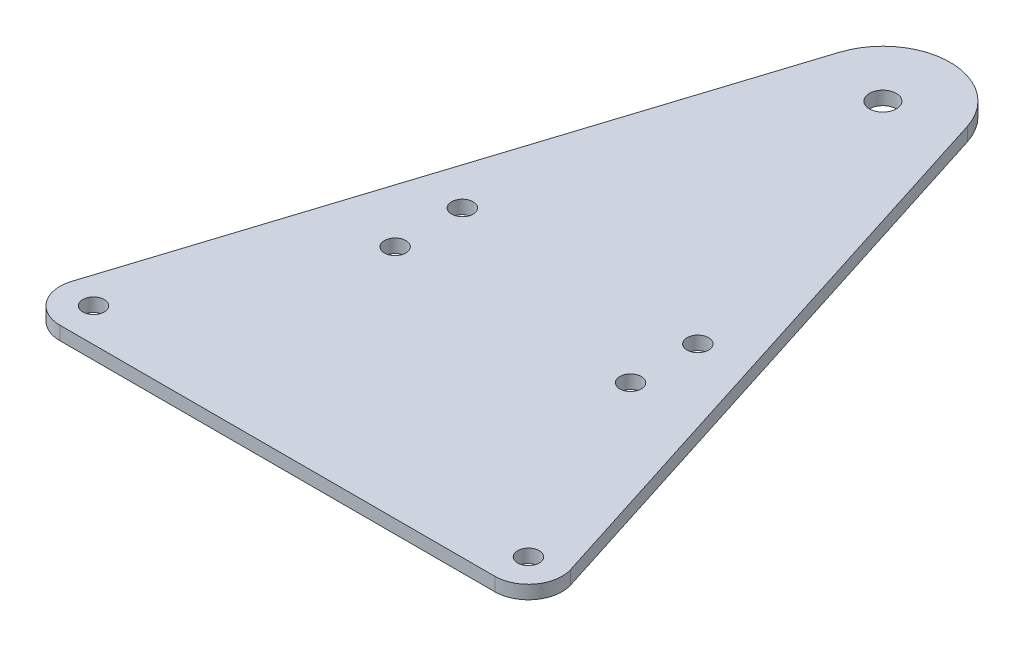
ISO-10303-21;
HEADER;
FILE_DESCRIPTION(('STEP AP214'),'2;1');
FILE_NAME('part.step','',(''),(''),'','','');
FILE_SCHEMA(('AUTOMOTIVE_DESIGN { 1 0 10303 214 1 1 1 1 }'));
ENDSEC;
DATA;
#1=APPLICATION_CONTEXT('core data for automotive mechanical design processes');
#2=APPLICATION_PROTOCOL_DEFINITION('international standard','automotive_design',2000,#1);
#3=PRODUCT_CONTEXT('',#1,'mechanical');
#4=PRODUCT('Part','Part','',(#3));
#5=PRODUCT_RELATED_PRODUCT_CATEGORY('part','',(#4));
#6=PRODUCT_DEFINITION_FORMATION('','',#4);
#7=PRODUCT_DEFINITION_CONTEXT('part definition',#1,'design');
#8=PRODUCT_DEFINITION('design','',#6,#7);
#9=PRODUCT_DEFINITION_SHAPE('','',#8);
#10=(LENGTH_UNIT() NAMED_UNIT(*) SI_UNIT(.MILLI.,.METRE.));
#11=(NAMED_UNIT(*) PLANE_ANGLE_UNIT() SI_UNIT($,.RADIAN.));
#12=(NAMED_UNIT(*) SI_UNIT($,.STERADIAN.) SOLID_ANGLE_UNIT());
#13=UNCERTAINTY_MEASURE_WITH_UNIT(LENGTH_MEASURE(1.E-05),#10,'distance_accuracy_value','');
#14=(GEOMETRIC_REPRESENTATION_CONTEXT(3) GLOBAL_UNCERTAINTY_ASSIGNED_CONTEXT((#13)) GLOBAL_UNIT_ASSIGNED_CONTEXT((#10,
#11,#12)) REPRESENTATION_CONTEXT('',''));
#15=CARTESIAN_POINT('',(0.,0.,0.));
#16=DIRECTION('',(0.,0.,1.));
#17=DIRECTION('',(1.,0.,0.));
#18=AXIS2_PLACEMENT_3D('',#15,#16,#17);
#19=CARTESIAN_POINT('',(0.,2.,0.));
#20=DIRECTION('',(0.,-1.,0.));
#21=DIRECTION('',(0.,0.,-1.));
#22=AXIS2_PLACEMENT_3D('',#19,#20,#21);
#23=PLANE('',#22);
#24=CARTESIAN_POINT('',(0.,2.,-80.));
#25=DIRECTION('',(0.,1.,0.));
#26=DIRECTION('',(0.,0.,1.));
#27=AXIS2_PLACEMENT_3D('',#24,#25,#26);
#28=CIRCLE('',#27,2.);
#29=CARTESIAN_POINT('',(0.,2.,-78.));
#30=VERTEX_POINT('',#29);
#31=EDGE_CURVE('E11',#30,#30,#28,.T.);
#32=ORIENTED_EDGE('',*,*,#31,.F.);
#33=EDGE_LOOP('',(#32));
#34=FACE_BOUND('',#33,.T.);
#35=CARTESIAN_POINT('',(-17.5,2.,-35.));
#36=DIRECTION('',(0.,1.,0.));
#37=DIRECTION('',(0.,0.,1.));
#38=AXIS2_PLACEMENT_3D('',#35,#36,#37);
#39=CIRCLE('',#38,1.6);
#40=CARTESIAN_POINT('',(-17.5,2.,-33.4));
#41=VERTEX_POINT('',#40);
#42=EDGE_CURVE('E172',#41,#41,#39,.T.);
#43=ORIENTED_EDGE('',*,*,#42,.F.);
#44=EDGE_LOOP('',(#43));
#45=FACE_BOUND('',#44,.T.);
#46=CARTESIAN_POINT('',(-17.5,2.,-25.));
#47=DIRECTION('',(0.,1.,0.));
#48=DIRECTION('',(0.,0.,-1.));
#49=AXIS2_PLACEMENT_3D('',#46,#47,#48);
#50=CIRCLE('',#49,1.6);
#51=CARTESIAN_POINT('',(-17.5,2.,-26.6));
#52=VERTEX_POINT('',#51);
#53=EDGE_CURVE('E154',#52,#52,#50,.T.);
#54=ORIENTED_EDGE('',*,*,#53,.F.);
#55=EDGE_LOOP('',(#54));
#56=FACE_BOUND('',#55,.T.);
#57=CARTESIAN_POINT('',(17.5,2.,-25.));
#58=DIRECTION('',(0.,1.,0.));
#59=DIRECTION('',(0.,0.,1.));
#60=AXIS2_PLACEMENT_3D('',#57,#58,#59);
#61=CIRCLE('',#60,1.6);
#62=CARTESIAN_POINT('',(17.5,2.,-23.4));
#63=VERTEX_POINT('',#62);
#64=EDGE_CURVE('E161',#63,#63,#61,.T.);
#65=ORIENTED_EDGE('',*,*,#64,.F.);
#66=EDGE_LOOP('',(#65));
#67=FACE_BOUND('',#66,.T.);
#68=CARTESIAN_POINT('',(17.5,2.,-35.));
#69=DIRECTION('',(0.,1.,0.));
#70=DIRECTION('',(0.,0.,-1.));
#71=AXIS2_PLACEMENT_3D('',#68,#69,#70);
#72=CIRCLE('',#71,1.6);
#73=CARTESIAN_POINT('',(17.5,2.,-36.6));
#74=VERTEX_POINT('',#73);
#75=EDGE_CURVE('E167',#74,#74,#72,.T.);
#76=ORIENTED_EDGE('',*,*,#75,.F.);
#77=EDGE_LOOP('',(#76));
#78=FACE_BOUND('',#77,.T.);
#79=CARTESIAN_POINT('',(-32.32051615,2.,5.00000000000001));
#80=DIRECTION('',(0.,1.,0.));
#81=DIRECTION('',(0.,0.,-1.));
#82=AXIS2_PLACEMENT_3D('',#79,#80,#81);
#83=CIRCLE('',#82,1.6);
#84=CARTESIAN_POINT('',(-32.32051615,2.,3.4));
#85=VERTEX_POINT('',#84);
#86=EDGE_CURVE('E149',#85,#85,#83,.T.);
#87=ORIENTED_EDGE('',*,*,#86,.F.);
#88=EDGE_LOOP('',(#87));
#89=FACE_BOUND('',#88,.T.);
#90=CARTESIAN_POINT('',(32.32051615,2.,5.));
#91=DIRECTION('',(0.,1.,0.));
#92=DIRECTION('',(0.,0.,1.));
#93=AXIS2_PLACEMENT_3D('',#90,#91,#92);
#94=CIRCLE('',#93,1.60000000000001);
#95=CARTESIAN_POINT('',(32.32051615,2.,6.6));
#96=VERTEX_POINT('',#95);
#97=EDGE_CURVE('E142',#96,#96,#94,.T.);
#98=ORIENTED_EDGE('',*,*,#97,.F.);
#99=EDGE_LOOP('',(#98));
#100=FACE_BOUND('',#99,.T.);
#101=CARTESIAN_POINT('',(32.32051615,2.,4.99999999999995));
#102=DIRECTION('',(0.,1.,0.));
#103=DIRECTION('',(0.,0.,1.));
#104=AXIS2_PLACEMENT_3D('',#101,#102,#103);
#105=CIRCLE('',#104,5.);
#106=CARTESIAN_POINT('',(37.0846983451408,2.,3.48257849906361));
#107=VERTEX_POINT('',#106);
#108=CARTESIAN_POINT('',(32.32051615,2.,9.99999999999995));
#109=VERTEX_POINT('',#108);
#110=EDGE_CURVE('E51',#107,#109,#105,.F.);
#111=ORIENTED_EDGE('',*,*,#110,.F.);
#112=DIRECTION('',(0.303484300187268,0.,0.952836439028149));
#113=VECTOR('',#112,1.);
#114=CARTESIAN_POINT('',(32.6620363815924,2.,-10.4030606386852));
#115=LINE('',#114,#113);
#116=CARTESIAN_POINT('',(9.52836439028149,2.,-83.0348430018727));
#117=VERTEX_POINT('',#116);
#118=EDGE_CURVE('E122',#117,#107,#115,.T.);
#119=ORIENTED_EDGE('',*,*,#118,.F.);
#120=CARTESIAN_POINT('',(0.,2.,-80.));
#121=DIRECTION('',(0.,1.,0.));
#122=DIRECTION('',(0.,0.,1.));
#123=AXIS2_PLACEMENT_3D('',#120,#121,#122);
#124=CIRCLE('',#123,10.);
#125=CARTESIAN_POINT('',(-9.5283643902815,2.,-83.0348430018727));
#126=VERTEX_POINT('',#125);
#127=EDGE_CURVE('E125',#117,#126,#124,.T.);
#128=ORIENTED_EDGE('',*,*,#127,.T.);
#129=DIRECTION('',(-0.303484300187268,0.,0.95283643902815));
#130=VECTOR('',#129,1.);
#131=CARTESIAN_POINT('',(-32.6620363815924,2.,-10.4030606386851));
#132=LINE('',#131,#130);
#133=CARTESIAN_POINT('',(-37.0846983451407,2.,3.48257849906367));
#134=VERTEX_POINT('',#133);
#135=EDGE_CURVE('E127',#126,#134,#132,.T.);
#136=ORIENTED_EDGE('',*,*,#135,.T.);
#137=CARTESIAN_POINT('',(-32.32051615,2.,5.00000000000001));
#138=DIRECTION('',(0.,1.,0.));
#139=DIRECTION('',(0.,0.,1.));
#140=AXIS2_PLACEMENT_3D('',#137,#138,#139);
#141=CIRCLE('',#140,5.);
#142=CARTESIAN_POINT('',(-32.32051615,2.,10.));
#143=VERTEX_POINT('',#142);
#144=EDGE_CURVE('E107',#134,#143,#141,.T.);
#145=ORIENTED_EDGE('',*,*,#144,.T.);
#146=DIRECTION('',(1.,0.,0.));
#147=VECTOR('',#146,1.);
#148=CARTESIAN_POINT('',(0.,2.,9.99999999999998));
#149=LINE('',#148,#147);
#150=EDGE_CURVE('E56',#143,#109,#149,.T.);
#151=ORIENTED_EDGE('',*,*,#150,.T.);
#152=EDGE_LOOP('',(#111,#119,#128,#136,#145,#151));
#153=FACE_BOUND('',#152,.T.);
#154=ADVANCED_FACE('F36',(#34,#45,#56,#67,#78,#89,#100,#153),#23,.F.);
#155=CARTESIAN_POINT('',(0.,0.,0.));
#156=DIRECTION('',(0.,-1.,0.));
#157=DIRECTION('',(0.,0.,-1.));
#158=AXIS2_PLACEMENT_3D('',#155,#156,#157);
#159=PLANE('',#158);
#160=CARTESIAN_POINT('',(0.,0.,-80.));
#161=DIRECTION('',(0.,-1.,0.));
#162=DIRECTION('',(0.,0.,-1.));
#163=AXIS2_PLACEMENT_3D('',#160,#161,#162);
#164=CIRCLE('',#163,2.);
#165=CARTESIAN_POINT('',(0.,0.,-82.));
#166=VERTEX_POINT('',#165);
#167=EDGE_CURVE('E40',#166,#166,#164,.F.);
#168=ORIENTED_EDGE('',*,*,#167,.T.);
#169=EDGE_LOOP('',(#168));
#170=FACE_BOUND('',#169,.T.);
#171=CARTESIAN_POINT('',(-17.5,0.,-35.));
#172=DIRECTION('',(0.,-1.,0.));
#173=DIRECTION('',(0.,0.,-1.));
#174=AXIS2_PLACEMENT_3D('',#171,#172,#173);
#175=CIRCLE('',#174,1.6);
#176=CARTESIAN_POINT('',(-17.5,0.,-36.6));
#177=VERTEX_POINT('',#176);
#178=EDGE_CURVE('E157',#177,#177,#175,.F.);
#179=ORIENTED_EDGE('',*,*,#178,.T.);
#180=EDGE_LOOP('',(#179));
#181=FACE_BOUND('',#180,.T.);
#182=CARTESIAN_POINT('',(-17.5,0.,-25.));
#183=DIRECTION('',(0.,-1.,0.));
#184=DIRECTION('',(0.,0.,-1.));
#185=AXIS2_PLACEMENT_3D('',#182,#183,#184);
#186=CIRCLE('',#185,1.6);
#187=CARTESIAN_POINT('',(-17.5,0.,-26.6));
#188=VERTEX_POINT('',#187);
#189=EDGE_CURVE('E158',#188,#188,#186,.F.);
#190=ORIENTED_EDGE('',*,*,#189,.T.);
#191=EDGE_LOOP('',(#190));
#192=FACE_BOUND('',#191,.T.);
#193=CARTESIAN_POINT('',(17.5,0.,-25.));
#194=DIRECTION('',(0.,-1.,0.));
#195=DIRECTION('',(0.,0.,-1.));
#196=AXIS2_PLACEMENT_3D('',#193,#194,#195);
#197=CIRCLE('',#196,1.6);
#198=CARTESIAN_POINT('',(17.5,0.,-26.6));
#199=VERTEX_POINT('',#198);
#200=EDGE_CURVE('E164',#199,#199,#197,.F.);
#201=ORIENTED_EDGE('',*,*,#200,.T.);
#202=EDGE_LOOP('',(#201));
#203=FACE_BOUND('',#202,.T.);
#204=CARTESIAN_POINT('',(17.5,0.,-35.));
#205=DIRECTION('',(0.,-1.,0.));
#206=DIRECTION('',(0.,0.,-1.));
#207=AXIS2_PLACEMENT_3D('',#204,#205,#206);
#208=CIRCLE('',#207,1.6);
#209=CARTESIAN_POINT('',(17.5,0.,-36.6));
#210=VERTEX_POINT('',#209);
#211=EDGE_CURVE('E145',#210,#210,#208,.F.);
#212=ORIENTED_EDGE('',*,*,#211,.T.);
#213=EDGE_LOOP('',(#212));
#214=FACE_BOUND('',#213,.T.);
#215=CARTESIAN_POINT('',(-32.32051615,0.,5.00000000000001));
#216=DIRECTION('',(0.,-1.,0.));
#217=DIRECTION('',(0.,0.,-1.));
#218=AXIS2_PLACEMENT_3D('',#215,#216,#217);
#219=CIRCLE('',#218,1.6);
#220=CARTESIAN_POINT('',(-32.32051615,0.,3.4));
#221=VERTEX_POINT('',#220);
#222=EDGE_CURVE('E135',#221,#221,#219,.F.);
#223=ORIENTED_EDGE('',*,*,#222,.T.);
#224=EDGE_LOOP('',(#223));
#225=FACE_BOUND('',#224,.T.);
#226=CARTESIAN_POINT('',(32.32051615,0.,5.));
#227=DIRECTION('',(0.,-1.,0.));
#228=DIRECTION('',(0.,0.,-1.));
#229=AXIS2_PLACEMENT_3D('',#226,#227,#228);
#230=CIRCLE('',#229,1.60000000000001);
#231=CARTESIAN_POINT('',(32.32051615,0.,3.39999999999999));
#232=VERTEX_POINT('',#231);
#233=EDGE_CURVE('E146',#232,#232,#230,.F.);
#234=ORIENTED_EDGE('',*,*,#233,.T.);
#235=EDGE_LOOP('',(#234));
#236=FACE_BOUND('',#235,.T.);
#237=DIRECTION('',(0.303484300187268,0.,0.952836439028149));
#238=VECTOR('',#237,1.);
#239=CARTESIAN_POINT('',(32.6620363815924,0.,-10.4030606386852));
#240=LINE('',#239,#238);
#241=CARTESIAN_POINT('',(9.52836439028149,0.,-83.0348430018727));
#242=VERTEX_POINT('',#241);
#243=CARTESIAN_POINT('',(37.0846983451408,0.,3.48257849906361));
#244=VERTEX_POINT('',#243);
#245=EDGE_CURVE('E120',#242,#244,#240,.T.);
#246=ORIENTED_EDGE('',*,*,#245,.T.);
#247=CARTESIAN_POINT('',(32.32051615,0.,4.99999999999995));
#248=DIRECTION('',(0.,-1.,0.));
#249=DIRECTION('',(0.,0.,-1.));
#250=AXIS2_PLACEMENT_3D('',#247,#248,#249);
#251=CIRCLE('',#250,5.);
#252=CARTESIAN_POINT('',(32.32051615,0.,9.99999999999995));
#253=VERTEX_POINT('',#252);
#254=EDGE_CURVE('E115',#244,#253,#251,.T.);
#255=ORIENTED_EDGE('',*,*,#254,.T.);
#256=DIRECTION('',(1.,0.,0.));
#257=VECTOR('',#256,1.);
#258=CARTESIAN_POINT('',(0.,0.,9.99999999999998));
#259=LINE('',#258,#257);
#260=CARTESIAN_POINT('',(-32.32051615,0.,10.));
#261=VERTEX_POINT('',#260);
#262=EDGE_CURVE('E113',#261,#253,#259,.T.);
#263=ORIENTED_EDGE('',*,*,#262,.F.);
#264=CARTESIAN_POINT('',(-32.32051615,0.,5.00000000000001));
#265=DIRECTION('',(0.,-1.,0.));
#266=DIRECTION('',(0.,0.,-1.));
#267=AXIS2_PLACEMENT_3D('',#264,#265,#266);
#268=CIRCLE('',#267,5.);
#269=CARTESIAN_POINT('',(-37.0846983451407,0.,3.48257849906367));
#270=VERTEX_POINT('',#269);
#271=EDGE_CURVE('E100',#270,#261,#268,.F.);
#272=ORIENTED_EDGE('',*,*,#271,.F.);
#273=DIRECTION('',(-0.303484300187268,0.,0.952836439028149));
#274=VECTOR('',#273,1.);
#275=CARTESIAN_POINT('',(-32.6620363815924,0.,-10.4030606386851));
#276=LINE('',#275,#274);
#277=CARTESIAN_POINT('',(-9.5283643902815,0.,-83.0348430018727));
#278=VERTEX_POINT('',#277);
#279=EDGE_CURVE('E89',#278,#270,#276,.T.);
#280=ORIENTED_EDGE('',*,*,#279,.F.);
#281=CARTESIAN_POINT('',(0.,0.,-80.));
#282=DIRECTION('',(0.,-1.,0.));
#283=DIRECTION('',(0.,0.,-1.));
#284=AXIS2_PLACEMENT_3D('',#281,#282,#283);
#285=CIRCLE('',#284,10.);
#286=EDGE_CURVE('E101',#242,#278,#285,.F.);
#287=ORIENTED_EDGE('',*,*,#286,.F.);
#288=EDGE_LOOP('',(#246,#255,#263,#272,#280,#287));
#289=FACE_BOUND('',#288,.T.);
#290=ADVANCED_FACE('F38',(#170,#181,#192,#203,#214,#225,#236,#289),#159,.T.);
#291=CARTESIAN_POINT('',(0.,-0.00100000000000013,-80.));
#292=DIRECTION('',(0.,1.,0.));
#293=DIRECTION('',(0.,0.,1.));
#294=AXIS2_PLACEMENT_3D('',#291,#292,#293);
#295=CYLINDRICAL_SURFACE('',#294,2.);
#296=ORIENTED_EDGE('',*,*,#167,.F.);
#297=EDGE_LOOP('',(#296));
#298=FACE_BOUND('',#297,.T.);
#299=ORIENTED_EDGE('',*,*,#31,.T.);
#300=EDGE_LOOP('',(#299));
#301=FACE_BOUND('',#300,.T.);
#302=ADVANCED_FACE('F184',(#298,#301),#295,.F.);
#303=CARTESIAN_POINT('',(-17.5,-0.00100000000000013,-35.));
#304=DIRECTION('',(0.,1.,0.));
#305=DIRECTION('',(0.,0.,1.));
#306=AXIS2_PLACEMENT_3D('',#303,#304,#305);
#307=CYLINDRICAL_SURFACE('',#306,1.6);
#308=ORIENTED_EDGE('',*,*,#178,.F.);
#309=EDGE_LOOP('',(#308));
#310=FACE_BOUND('',#309,.T.);
#311=ORIENTED_EDGE('',*,*,#42,.T.);
#312=EDGE_LOOP('',(#311));
#313=FACE_BOUND('',#312,.T.);
#314=ADVANCED_FACE('F180',(#310,#313),#307,.F.);
#315=CARTESIAN_POINT('',(-17.5,-0.00100000000000013,-25.));
#316=DIRECTION('',(0.,1.,0.));
#317=DIRECTION('',(0.,0.,1.));
#318=AXIS2_PLACEMENT_3D('',#315,#316,#317);
#319=CYLINDRICAL_SURFACE('',#318,1.6);
#320=ORIENTED_EDGE('',*,*,#189,.F.);
#321=EDGE_LOOP('',(#320));
#322=FACE_BOUND('',#321,.T.);
#323=ORIENTED_EDGE('',*,*,#53,.T.);
#324=EDGE_LOOP('',(#323));
#325=FACE_BOUND('',#324,.T.);
#326=ADVANCED_FACE('F183',(#322,#325),#319,.F.);
#327=CARTESIAN_POINT('',(17.5,-0.00100000000000013,-25.));
#328=DIRECTION('',(0.,1.,0.));
#329=DIRECTION('',(0.,0.,1.));
#330=AXIS2_PLACEMENT_3D('',#327,#328,#329);
#331=CYLINDRICAL_SURFACE('',#330,1.6);
#332=ORIENTED_EDGE('',*,*,#200,.F.);
#333=EDGE_LOOP('',(#332));
#334=FACE_BOUND('',#333,.T.);
#335=ORIENTED_EDGE('',*,*,#64,.T.);
#336=EDGE_LOOP('',(#335));
#337=FACE_BOUND('',#336,.T.);
#338=ADVANCED_FACE('F222',(#334,#337),#331,.F.);
#339=CARTESIAN_POINT('',(17.5,-0.00100000000000013,-35.));
#340=DIRECTION('',(0.,1.,0.));
#341=DIRECTION('',(0.,0.,1.));
#342=AXIS2_PLACEMENT_3D('',#339,#340,#341);
#343=CYLINDRICAL_SURFACE('',#342,1.6);
#344=ORIENTED_EDGE('',*,*,#211,.F.);
#345=EDGE_LOOP('',(#344));
#346=FACE_BOUND('',#345,.T.);
#347=ORIENTED_EDGE('',*,*,#75,.T.);
#348=EDGE_LOOP('',(#347));
#349=FACE_BOUND('',#348,.T.);
#350=ADVANCED_FACE('F214',(#346,#349),#343,.F.);
#351=CARTESIAN_POINT('',(-32.32051615,-0.00100000000000013,5.00000000000001));
#352=DIRECTION('',(0.,1.,0.));
#353=DIRECTION('',(0.,0.,1.));
#354=AXIS2_PLACEMENT_3D('',#351,#352,#353);
#355=CYLINDRICAL_SURFACE('',#354,1.6);
#356=ORIENTED_EDGE('',*,*,#222,.F.);
#357=EDGE_LOOP('',(#356));
#358=FACE_BOUND('',#357,.T.);
#359=ORIENTED_EDGE('',*,*,#86,.T.);
#360=EDGE_LOOP('',(#359));
#361=FACE_BOUND('',#360,.T.);
#362=ADVANCED_FACE('F204',(#358,#361),#355,.F.);
#363=CARTESIAN_POINT('',(32.32051615,-0.00100000000000013,5.));
#364=DIRECTION('',(0.,1.,0.));
#365=DIRECTION('',(0.,0.,1.));
#366=AXIS2_PLACEMENT_3D('',#363,#364,#365);
#367=CYLINDRICAL_SURFACE('',#366,1.60000000000001);
#368=ORIENTED_EDGE('',*,*,#233,.F.);
#369=EDGE_LOOP('',(#368));
#370=FACE_BOUND('',#369,.T.);
#371=ORIENTED_EDGE('',*,*,#97,.T.);
#372=EDGE_LOOP('',(#371));
#373=FACE_BOUND('',#372,.T.);
#374=ADVANCED_FACE('F201',(#370,#373),#367,.F.);
#375=CARTESIAN_POINT('',(32.6620363815924,-0.00100000000000013,-10.4030606386852));
#376=DIRECTION('',(-0.952836439028149,0.,0.303484300187268));
#377=DIRECTION('',(0.303484300187268,0.,0.952836439028149));
#378=AXIS2_PLACEMENT_3D('',#375,#376,#377);
#379=PLANE('',#378);
#380=ORIENTED_EDGE('',*,*,#245,.F.);
#381=DIRECTION('',(0.,1.,0.));
#382=VECTOR('',#381,1.);
#383=CARTESIAN_POINT('',(9.52836439028149,-0.00100000000000013,-83.0348430018727));
#384=LINE('',#383,#382);
#385=EDGE_CURVE('E132',#242,#117,#384,.T.);
#386=ORIENTED_EDGE('',*,*,#385,.T.);
#387=ORIENTED_EDGE('',*,*,#118,.T.);
#388=DIRECTION('',(0.,1.,0.));
#389=VECTOR('',#388,1.);
#390=CARTESIAN_POINT('',(37.0846983451408,-0.00100000000000013,3.48257849906361));
#391=LINE('',#390,#389);
#392=EDGE_CURVE('E133',#244,#107,#391,.T.);
#393=ORIENTED_EDGE('',*,*,#392,.F.);
#394=EDGE_LOOP('',(#380,#386,#387,#393));
#395=FACE_BOUND('',#394,.T.);
#396=ADVANCED_FACE('F203',(#395),#379,.F.);
#397=CARTESIAN_POINT('',(32.32051615,-0.00100000000000013,4.99999999999995));
#398=DIRECTION('',(0.,1.,0.));
#399=DIRECTION('',(0.,0.,1.));
#400=AXIS2_PLACEMENT_3D('',#397,#398,#399);
#401=CYLINDRICAL_SURFACE('',#400,5.);
#402=ORIENTED_EDGE('',*,*,#254,.F.);
#403=ORIENTED_EDGE('',*,*,#392,.T.);
#404=ORIENTED_EDGE('',*,*,#110,.T.);
#405=DIRECTION('',(0.,1.,0.));
#406=VECTOR('',#405,1.);
#407=CARTESIAN_POINT('',(32.32051615,-0.00100000000000013,9.99999999999995));
#408=LINE('',#407,#406);
#409=EDGE_CURVE('E136',#253,#109,#408,.T.);
#410=ORIENTED_EDGE('',*,*,#409,.F.);
#411=EDGE_LOOP('',(#402,#403,#404,#410));
#412=FACE_BOUND('',#411,.T.);
#413=ADVANCED_FACE('F211',(#412),#401,.T.);
#414=CARTESIAN_POINT('',(0.,-0.00100000000000013,9.99999999999998));
#415=DIRECTION('',(0.,0.,1.));
#416=DIRECTION('',(1.,0.,0.));
#417=AXIS2_PLACEMENT_3D('',#414,#415,#416);
#418=PLANE('',#417);
#419=DIRECTION('',(0.,1.,0.));
#420=VECTOR('',#419,1.);
#421=CARTESIAN_POINT('',(-32.32051615,-0.00100000000000013,10.));
#422=LINE('',#421,#420);
#423=EDGE_CURVE('E108',#261,#143,#422,.T.);
#424=ORIENTED_EDGE('',*,*,#423,.F.);
#425=ORIENTED_EDGE('',*,*,#262,.T.);
#426=ORIENTED_EDGE('',*,*,#409,.T.);
#427=ORIENTED_EDGE('',*,*,#150,.F.);
#428=EDGE_LOOP('',(#424,#425,#426,#427));
#429=FACE_BOUND('',#428,.T.);
#430=ADVANCED_FACE('F301',(#429),#418,.T.);
#431=CARTESIAN_POINT('',(-32.32051615,-0.00100000000000013,5.00000000000001));
#432=DIRECTION('',(0.,1.,0.));
#433=DIRECTION('',(0.,0.,1.));
#434=AXIS2_PLACEMENT_3D('',#431,#432,#433);
#435=CYLINDRICAL_SURFACE('',#434,5.);
#436=DIRECTION('',(0.,1.,0.));
#437=VECTOR('',#436,1.);
#438=CARTESIAN_POINT('',(-37.0846983451408,-0.00100000000000013,3.48257849906366));
#439=LINE('',#438,#437);
#440=EDGE_CURVE('E93',#270,#134,#439,.T.);
#441=ORIENTED_EDGE('',*,*,#440,.F.);
#442=ORIENTED_EDGE('',*,*,#271,.T.);
#443=ORIENTED_EDGE('',*,*,#423,.T.);
#444=ORIENTED_EDGE('',*,*,#144,.F.);
#445=EDGE_LOOP('',(#441,#442,#443,#444));
#446=FACE_BOUND('',#445,.T.);
#447=ADVANCED_FACE('F104',(#446),#435,.T.);
#448=CARTESIAN_POINT('',(-32.6620363815924,-0.00100000000000013,-10.4030606386851));
#449=DIRECTION('',(-0.952836439028149,0.,-0.303484300187268));
#450=DIRECTION('',(-0.303484300187268,0.,0.952836439028149));
#451=AXIS2_PLACEMENT_3D('',#448,#449,#450);
#452=PLANE('',#451);
#453=DIRECTION('',(0.,1.,0.));
#454=VECTOR('',#453,1.);
#455=CARTESIAN_POINT('',(-9.5283643902815,-0.00100000000000013,-83.0348430018727));
#456=LINE('',#455,#454);
#457=EDGE_CURVE('E96',#278,#126,#456,.T.);
#458=ORIENTED_EDGE('',*,*,#457,.F.);
#459=ORIENTED_EDGE('',*,*,#279,.T.);
#460=ORIENTED_EDGE('',*,*,#440,.T.);
#461=ORIENTED_EDGE('',*,*,#135,.F.);
#462=EDGE_LOOP('',(#458,#459,#460,#461));
#463=FACE_BOUND('',#462,.T.);
#464=ADVANCED_FACE('F91',(#463),#452,.T.);
#465=CARTESIAN_POINT('',(0.,-0.00100000000000013,-80.));
#466=DIRECTION('',(0.,1.,0.));
#467=DIRECTION('',(0.,0.,1.));
#468=AXIS2_PLACEMENT_3D('',#465,#466,#467);
#469=CYLINDRICAL_SURFACE('',#468,10.);
#470=ORIENTED_EDGE('',*,*,#385,.F.);
#471=ORIENTED_EDGE('',*,*,#286,.T.);
#472=ORIENTED_EDGE('',*,*,#457,.T.);
#473=ORIENTED_EDGE('',*,*,#127,.F.);
#474=EDGE_LOOP('',(#470,#471,#472,#473));
#475=FACE_BOUND('',#474,.T.);
#476=ADVANCED_FACE('F325',(#475),#469,.T.);
#477=CLOSED_SHELL('',(#154,#290,#302,#314,#326,#338,#350,#362,#374,#396,#413,#430,#447,#464,#476));
#478=MANIFOLD_SOLID_BREP('B2',#477);
#479=ADVANCED_BREP_SHAPE_REPRESENTATION('',(#18,#478),#14);
#480=SHAPE_DEFINITION_REPRESENTATION(#9,#479);
ENDSEC;
END-ISO-10303-21;
